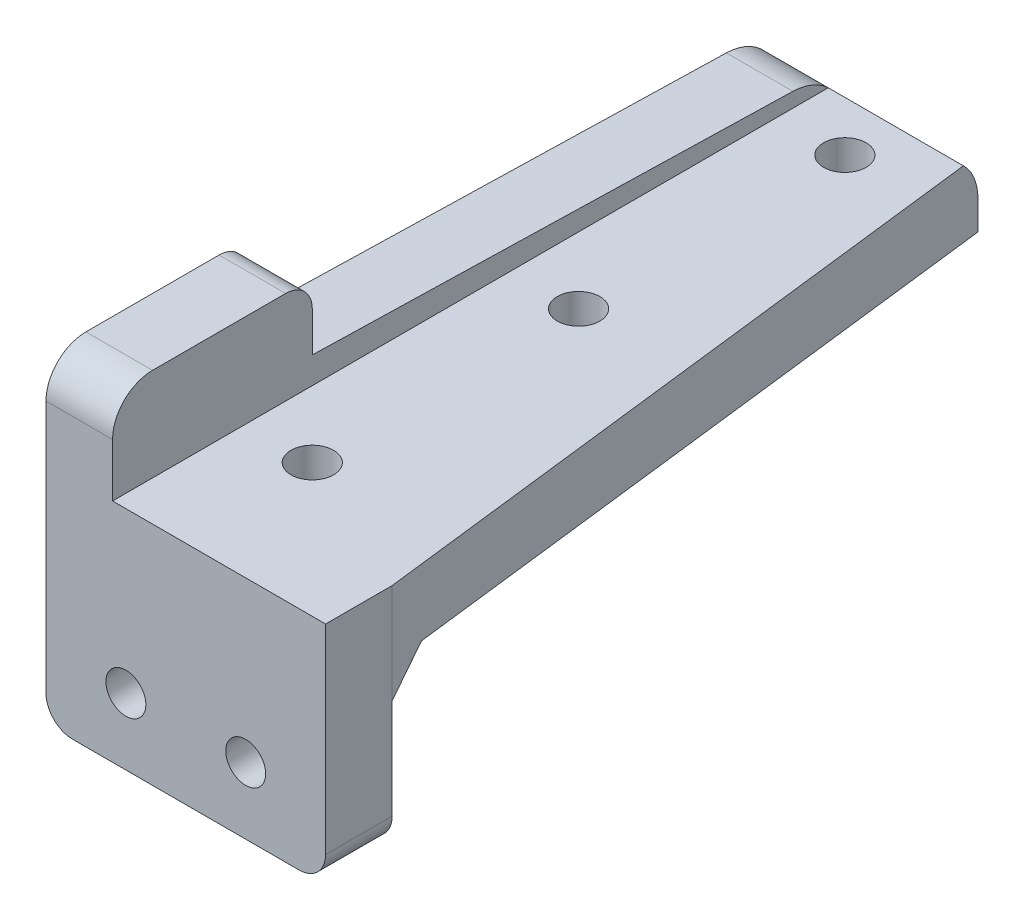
ISO-10303-21;
HEADER;
FILE_DESCRIPTION(('STEP AP214'),'2;1');
FILE_NAME('part.step','',(''),(''),'','','');
FILE_SCHEMA(('AUTOMOTIVE_DESIGN { 1 0 10303 214 1 1 1 1 }'));
ENDSEC;
DATA;
#1=APPLICATION_CONTEXT('core data for automotive mechanical design processes');
#2=APPLICATION_PROTOCOL_DEFINITION('international standard','automotive_design',2000,#1);
#3=PRODUCT_CONTEXT('',#1,'mechanical');
#4=PRODUCT('Part','Part','',(#3));
#5=PRODUCT_RELATED_PRODUCT_CATEGORY('part','',(#4));
#6=PRODUCT_DEFINITION_FORMATION('','',#4);
#7=PRODUCT_DEFINITION_CONTEXT('part definition',#1,'design');
#8=PRODUCT_DEFINITION('design','',#6,#7);
#9=PRODUCT_DEFINITION_SHAPE('','',#8);
#10=(LENGTH_UNIT() NAMED_UNIT(*) SI_UNIT(.MILLI.,.METRE.));
#11=(NAMED_UNIT(*) PLANE_ANGLE_UNIT() SI_UNIT($,.RADIAN.));
#12=(NAMED_UNIT(*) SI_UNIT($,.STERADIAN.) SOLID_ANGLE_UNIT());
#13=UNCERTAINTY_MEASURE_WITH_UNIT(LENGTH_MEASURE(1.E-05),#10,'distance_accuracy_value','');
#14=(GEOMETRIC_REPRESENTATION_CONTEXT(3) GLOBAL_UNCERTAINTY_ASSIGNED_CONTEXT((#13)) GLOBAL_UNIT_ASSIGNED_CONTEXT((#10,
#11,#12)) REPRESENTATION_CONTEXT('',''));
#15=CARTESIAN_POINT('',(0.,0.,0.));
#16=DIRECTION('',(0.,0.,1.));
#17=DIRECTION('',(1.,0.,0.));
#18=AXIS2_PLACEMENT_3D('',#15,#16,#17);
#19=CARTESIAN_POINT('',(0.,0.,25.));
#20=DIRECTION('',(0.,0.,1.));
#21=DIRECTION('',(1.,0.,0.));
#22=AXIS2_PLACEMENT_3D('',#19,#20,#21);
#23=PLANE('',#22);
#24=CARTESIAN_POINT('',(7.5,-7.,25.));
#25=DIRECTION('',(0.,0.,1.));
#26=DIRECTION('',(1.,0.,0.));
#27=AXIS2_PLACEMENT_3D('',#24,#25,#26);
#28=CIRCLE('',#27,1.5);
#29=CARTESIAN_POINT('',(9.00000000000001,-7.,25.));
#30=VERTEX_POINT('',#29);
#31=EDGE_CURVE('E568',#30,#30,#28,.T.);
#32=ORIENTED_EDGE('',*,*,#31,.T.);
#33=EDGE_LOOP('',(#32));
#34=FACE_BOUND('',#33,.T.);
#35=CARTESIAN_POINT('',(-1.5,-7.,25.));
#36=DIRECTION('',(0.,0.,1.));
#37=DIRECTION('',(1.,0.,0.));
#38=AXIS2_PLACEMENT_3D('',#35,#36,#37);
#39=CIRCLE('',#38,1.5);
#40=CARTESIAN_POINT('',(0.,-7.,25.));
#41=VERTEX_POINT('',#40);
#42=EDGE_CURVE('E587',#41,#41,#39,.T.);
#43=ORIENTED_EDGE('',*,*,#42,.T.);
#44=EDGE_LOOP('',(#43));
#45=FACE_BOUND('',#44,.T.);
#46=DIRECTION('',(0.,1.,0.));
#47=VECTOR('',#46,1.);
#48=CARTESIAN_POINT('',(13.5,0.,25.));
#49=LINE('',#48,#47);
#50=CARTESIAN_POINT('',(13.5,-10.,25.));
#51=VERTEX_POINT('',#50);
#52=CARTESIAN_POINT('',(13.5,-2.5,25.));
#53=VERTEX_POINT('',#52);
#54=EDGE_CURVE('E263',#51,#53,#49,.T.);
#55=ORIENTED_EDGE('',*,*,#54,.F.);
#56=CARTESIAN_POINT('',(11.5,-10.,25.));
#57=DIRECTION('',(0.,0.,1.));
#58=DIRECTION('',(1.,0.,0.));
#59=AXIS2_PLACEMENT_3D('',#56,#57,#58);
#60=CIRCLE('',#59,2.);
#61=CARTESIAN_POINT('',(11.5,-12.,25.));
#62=VERTEX_POINT('',#61);
#63=EDGE_CURVE('E12',#51,#62,#60,.F.);
#64=ORIENTED_EDGE('',*,*,#63,.T.);
#65=DIRECTION('',(1.,0.,0.));
#66=VECTOR('',#65,1.);
#67=CARTESIAN_POINT('',(-7.5,-12.,25.));
#68=LINE('',#67,#66);
#69=CARTESIAN_POINT('',(-4.5,-12.,25.));
#70=VERTEX_POINT('',#69);
#71=EDGE_CURVE('E233',#70,#62,#68,.T.);
#72=ORIENTED_EDGE('',*,*,#71,.F.);
#73=DIRECTION('',(0.,1.,0.));
#74=VECTOR('',#73,1.);
#75=CARTESIAN_POINT('',(-4.5,-12.,25.));
#76=LINE('',#75,#74);
#77=CARTESIAN_POINT('',(-4.5,-2.5,25.));
#78=VERTEX_POINT('',#77);
#79=EDGE_CURVE('E244',#70,#78,#76,.T.);
#80=ORIENTED_EDGE('',*,*,#79,.T.);
#81=DIRECTION('',(1.,0.,0.));
#82=VECTOR('',#81,1.);
#83=CARTESIAN_POINT('',(13.5,-2.5,25.));
#84=LINE('',#83,#82);
#85=EDGE_CURVE('E385',#78,#53,#84,.T.);
#86=ORIENTED_EDGE('',*,*,#85,.T.);
#87=EDGE_LOOP('',(#55,#64,#72,#80,#86));
#88=FACE_BOUND('',#87,.T.);
#89=ADVANCED_FACE('F101',(#34,#45,#88),#23,.F.);
#90=CARTESIAN_POINT('',(0.,-2.5,25.));
#91=DIRECTION('',(0.,-0.707106781186544,-0.707106781186551));
#92=DIRECTION('',(-1.,0.,0.));
#93=AXIS2_PLACEMENT_3D('',#90,#91,#92);
#94=PLANE('',#93);
#95=DIRECTION('',(0.,0.707106781186551,-0.707106781186544));
#96=VECTOR('',#95,1.);
#97=CARTESIAN_POINT('',(-4.5,-2.5,25.));
#98=LINE('',#97,#96);
#99=CARTESIAN_POINT('',(-4.5,0.,22.5));
#100=VERTEX_POINT('',#99);
#101=EDGE_CURVE('E249',#78,#100,#98,.T.);
#102=ORIENTED_EDGE('',*,*,#101,.T.);
#103=DIRECTION('',(-1.,0.,0.));
#104=VECTOR('',#103,1.);
#105=CARTESIAN_POINT('',(-7.5,0.,22.5));
#106=LINE('',#105,#104);
#107=CARTESIAN_POINT('',(13.2,0.,22.5));
#108=VERTEX_POINT('',#107);
#109=EDGE_CURVE('E388',#108,#100,#106,.T.);
#110=ORIENTED_EDGE('',*,*,#109,.F.);
#111=DIRECTION('',(0.0845489833163308,-0.704574860969431,0.704574860969423));
#112=VECTOR('',#111,1.);
#113=CARTESIAN_POINT('',(13.4034948371724,-1.69579030976966,24.1957903097697));
#114=LINE('',#113,#112);
#115=EDGE_CURVE('E392',#53,#108,#114,.F.);
#116=ORIENTED_EDGE('',*,*,#115,.F.);
#117=ORIENTED_EDGE('',*,*,#85,.F.);
#118=EDGE_LOOP('',(#102,#110,#116,#117));
#119=FACE_BOUND('',#118,.T.);
#120=ADVANCED_FACE('F436',(#119),#94,.T.);
#121=CARTESIAN_POINT('',(10.3509463722398,5.,-1.24211356466877));
#122=DIRECTION('',(0.992876838486922,0.,-0.119145220618431));
#123=DIRECTION('',(-0.119145220618431,0.,-0.992876838486922));
#124=AXIS2_PLACEMENT_3D('',#121,#122,#123);
#125=PLANE('',#124);
#126=DIRECTION('',(0.,-1.,0.));
#127=VECTOR('',#126,1.);
#128=CARTESIAN_POINT('',(7.5,5.,-25.));
#129=LINE('',#128,#127);
#130=CARTESIAN_POINT('',(7.5,2.09875019525149,-25.));
#131=VERTEX_POINT('',#130);
#132=CARTESIAN_POINT('',(7.5,0.,-25.));
#133=VERTEX_POINT('',#132);
#134=EDGE_CURVE('E346',#131,#133,#129,.T.);
#135=ORIENTED_EDGE('',*,*,#134,.F.);
#136=CARTESIAN_POINT('',(7.98,2.09875019525149,-21.));
#137=DIRECTION('',(0.992876838486922,0.,-0.119145220618431));
#138=DIRECTION('',(0.119145220618431,0.,0.992876838486922));
#139=AXIS2_PLACEMENT_3D('',#136,#137,#138);
#140=ELLIPSE('',#139,4.02869705984453,4.);
#141=CARTESIAN_POINT('',(7.649558486545,5.,-23.7536792787917));
#142=VERTEX_POINT('',#141);
#143=EDGE_CURVE('E363',#131,#142,#140,.T.);
#144=ORIENTED_EDGE('',*,*,#143,.T.);
#145=DIRECTION('',(0.119145220618431,0.,0.992876838486922));
#146=VECTOR('',#145,1.);
#147=CARTESIAN_POINT('',(10.3509463722398,5.,-1.24211356466877));
#148=LINE('',#147,#146);
#149=CARTESIAN_POINT('',(13.5,5.,25.));
#150=VERTEX_POINT('',#149);
#151=EDGE_CURVE('E329',#142,#150,#148,.T.);
#152=ORIENTED_EDGE('',*,*,#151,.T.);
#153=DIRECTION('',(0.,-1.,0.));
#154=VECTOR('',#153,1.);
#155=CARTESIAN_POINT('',(13.5,5.,25.));
#156=LINE('',#155,#154);
#157=EDGE_CURVE('E349',#150,#53,#156,.T.);
#158=ORIENTED_EDGE('',*,*,#157,.T.);
#159=ORIENTED_EDGE('',*,*,#115,.T.);
#160=DIRECTION('',(0.119145220618431,0.,0.992876838486922));
#161=VECTOR('',#160,1.);
#162=CARTESIAN_POINT('',(10.3509463722398,0.,-1.24211356466877));
#163=LINE('',#162,#161);
#164=EDGE_CURVE('E328',#133,#108,#163,.T.);
#165=ORIENTED_EDGE('',*,*,#164,.F.);
#166=EDGE_LOOP('',(#135,#144,#152,#158,#159,#165));
#167=FACE_BOUND('',#166,.T.);
#168=ADVANCED_FACE('F432',(#167),#125,.T.);
#169=CARTESIAN_POINT('',(0.,5.,-25.));
#170=DIRECTION('',(0.,0.,-1.));
#171=DIRECTION('',(-1.,0.,0.));
#172=AXIS2_PLACEMENT_3D('',#169,#170,#171);
#173=PLANE('',#172);
#174=DIRECTION('',(0.,-1.,0.));
#175=VECTOR('',#174,1.);
#176=CARTESIAN_POINT('',(-7.5,5.,-25.));
#177=LINE('',#176,#175);
#178=CARTESIAN_POINT('',(-7.5,2.09875019525149,-25.));
#179=VERTEX_POINT('',#178);
#180=CARTESIAN_POINT('',(-7.5,0.,-25.));
#181=VERTEX_POINT('',#180);
#182=EDGE_CURVE('E332',#179,#181,#177,.T.);
#183=ORIENTED_EDGE('',*,*,#182,.F.);
#184=DIRECTION('',(-1.,0.,0.));
#185=VECTOR('',#184,1.);
#186=CARTESIAN_POINT('',(-2.5,2.09875019525149,-25.));
#187=LINE('',#186,#185);
#188=EDGE_CURVE('E360',#179,#131,#187,.F.);
#189=ORIENTED_EDGE('',*,*,#188,.T.);
#190=ORIENTED_EDGE('',*,*,#134,.T.);
#191=DIRECTION('',(1.,0.,0.));
#192=VECTOR('',#191,1.);
#193=CARTESIAN_POINT('',(0.,0.,-25.));
#194=LINE('',#193,#192);
#195=EDGE_CURVE('E337',#181,#133,#194,.T.);
#196=ORIENTED_EDGE('',*,*,#195,.F.);
#197=EDGE_LOOP('',(#183,#189,#190,#196));
#198=FACE_BOUND('',#197,.T.);
#199=ADVANCED_FACE('F534',(#198),#173,.T.);
#200=CARTESIAN_POINT('',(-7.5,5.,0.));
#201=DIRECTION('',(-1.,0.,0.));
#202=DIRECTION('',(0.,0.,1.));
#203=AXIS2_PLACEMENT_3D('',#200,#201,#202);
#204=PLANE('',#203);
#205=DIRECTION('',(0.,-0.346374082759159,0.938096474139388));
#206=VECTOR('',#205,1.);
#207=CARTESIAN_POINT('',(-7.5,0.,-7.49999999999997));
#208=LINE('',#207,#206);
#209=CARTESIAN_POINT('',(-7.5,0.,-7.49999999999997));
#210=VERTEX_POINT('',#209);
#211=CARTESIAN_POINT('',(-7.5,-10.,19.5833333333333));
#212=VERTEX_POINT('',#211);
#213=EDGE_CURVE('E259',#210,#212,#208,.T.);
#214=ORIENTED_EDGE('',*,*,#213,.T.);
#215=DIRECTION('',(0.,0.,-1.));
#216=VECTOR('',#215,1.);
#217=CARTESIAN_POINT('',(-7.5,-10.,30.));
#218=LINE('',#217,#216);
#219=CARTESIAN_POINT('',(-7.5,-10.,30.));
#220=VERTEX_POINT('',#219);
#221=EDGE_CURVE('E416',#212,#220,#218,.F.);
#222=ORIENTED_EDGE('',*,*,#221,.T.);
#223=DIRECTION('',(0.,-1.,0.));
#224=VECTOR('',#223,1.);
#225=CARTESIAN_POINT('',(-7.5,12.,30.));
#226=LINE('',#225,#224);
#227=CARTESIAN_POINT('',(-7.5,9.00000000000001,30.));
#228=VERTEX_POINT('',#227);
#229=EDGE_CURVE('E462',#228,#220,#226,.T.);
#230=ORIENTED_EDGE('',*,*,#229,.F.);
#231=CARTESIAN_POINT('',(-7.5,9.00000000000001,27.));
#232=DIRECTION('',(-1.,0.,0.));
#233=DIRECTION('',(0.,0.,1.));
#234=AXIS2_PLACEMENT_3D('',#231,#232,#233);
#235=CIRCLE('',#234,3.);
#236=CARTESIAN_POINT('',(-7.5,12.,27.));
#237=VERTEX_POINT('',#236);
#238=EDGE_CURVE('E399',#228,#237,#235,.T.);
#239=ORIENTED_EDGE('',*,*,#238,.T.);
#240=DIRECTION('',(0.,0.,1.));
#241=VECTOR('',#240,1.);
#242=CARTESIAN_POINT('',(-7.5,12.,0.));
#243=LINE('',#242,#241);
#244=CARTESIAN_POINT('',(-7.5,12.,17.));
#245=VERTEX_POINT('',#244);
#246=EDGE_CURVE('E279',#245,#237,#243,.T.);
#247=ORIENTED_EDGE('',*,*,#246,.F.);
#248=CARTESIAN_POINT('',(-7.5,10.,17.));
#249=DIRECTION('',(-1.,0.,0.));
#250=DIRECTION('',(0.,0.,1.));
#251=AXIS2_PLACEMENT_3D('',#248,#249,#250);
#252=CIRCLE('',#251,2.);
#253=CARTESIAN_POINT('',(-7.5,10.,15.));
#254=VERTEX_POINT('',#253);
#255=EDGE_CURVE('E376',#245,#254,#252,.T.);
#256=ORIENTED_EDGE('',*,*,#255,.T.);
#257=DIRECTION('',(0.,1.,0.));
#258=VECTOR('',#257,1.);
#259=CARTESIAN_POINT('',(-7.5,0.,15.));
#260=LINE('',#259,#258);
#261=CARTESIAN_POINT('',(-7.5,7.00000000000001,15.));
#262=VERTEX_POINT('',#261);
#263=EDGE_CURVE('E319',#262,#254,#260,.T.);
#264=ORIENTED_EDGE('',*,*,#263,.F.);
#265=DIRECTION('',(0.,0.0249921911602033,0.999687646408123));
#266=VECTOR('',#265,1.);
#267=CARTESIAN_POINT('',(-7.5,6.62086196127421,-0.165521549031856));
#268=LINE('',#267,#266);
#269=CARTESIAN_POINT('',(-7.5,6.09750078088398,-21.0999687646408));
#270=VERTEX_POINT('',#269);
#271=EDGE_CURVE('E304',#270,#262,#268,.T.);
#272=ORIENTED_EDGE('',*,*,#271,.F.);
#273=CARTESIAN_POINT('',(-7.5,2.09875019525149,-21.));
#274=DIRECTION('',(-1.,0.,0.));
#275=DIRECTION('',(0.,0.,1.));
#276=AXIS2_PLACEMENT_3D('',#273,#274,#275);
#277=CIRCLE('',#276,4.);
#278=EDGE_CURVE('E357',#270,#179,#277,.T.);
#279=ORIENTED_EDGE('',*,*,#278,.T.);
#280=ORIENTED_EDGE('',*,*,#182,.T.);
#281=DIRECTION('',(0.,0.,-1.));
#282=VECTOR('',#281,1.);
#283=CARTESIAN_POINT('',(-7.5,0.,0.));
#284=LINE('',#283,#282);
#285=EDGE_CURVE('E333',#210,#181,#284,.T.);
#286=ORIENTED_EDGE('',*,*,#285,.F.);
#287=EDGE_LOOP('',(#214,#222,#230,#239,#247,#256,#264,#272,#279,#280,#286));
#288=FACE_BOUND('',#287,.T.);
#289=ADVANCED_FACE('F527',(#288),#204,.T.);
#290=CARTESIAN_POINT('',(0.,5.,0.));
#291=DIRECTION('',(0.,1.,0.));
#292=DIRECTION('',(0.,0.,1.));
#293=AXIS2_PLACEMENT_3D('',#290,#291,#292);
#294=PLANE('',#293);
#295=CARTESIAN_POINT('',(2.5,5.,-20.));
#296=DIRECTION('',(0.,1.,0.));
#297=DIRECTION('',(0.,0.,1.));
#298=AXIS2_PLACEMENT_3D('',#295,#296,#297);
#299=CIRCLE('',#298,1.6);
#300=CARTESIAN_POINT('',(2.5,5.,-18.4));
#301=VERTEX_POINT('',#300);
#302=EDGE_CURVE('E280',#301,#301,#299,.T.);
#303=ORIENTED_EDGE('',*,*,#302,.F.);
#304=EDGE_LOOP('',(#303));
#305=FACE_BOUND('',#304,.T.);
#306=CARTESIAN_POINT('',(2.5,5.,0.));
#307=DIRECTION('',(0.,1.,0.));
#308=DIRECTION('',(0.,0.,1.));
#309=AXIS2_PLACEMENT_3D('',#306,#307,#308);
#310=CIRCLE('',#309,1.6);
#311=CARTESIAN_POINT('',(2.5,5.,1.6));
#312=VERTEX_POINT('',#311);
#313=EDGE_CURVE('E284',#312,#312,#310,.T.);
#314=ORIENTED_EDGE('',*,*,#313,.F.);
#315=EDGE_LOOP('',(#314));
#316=FACE_BOUND('',#315,.T.);
#317=CARTESIAN_POINT('',(2.5,5.,20.));
#318=DIRECTION('',(0.,1.,0.));
#319=DIRECTION('',(0.,0.,1.));
#320=AXIS2_PLACEMENT_3D('',#317,#318,#319);
#321=CIRCLE('',#320,1.6);
#322=CARTESIAN_POINT('',(2.5,5.,21.6));
#323=VERTEX_POINT('',#322);
#324=EDGE_CURVE('E292',#323,#323,#321,.T.);
#325=ORIENTED_EDGE('',*,*,#324,.F.);
#326=EDGE_LOOP('',(#325));
#327=FACE_BOUND('',#326,.T.);
#328=ORIENTED_EDGE('',*,*,#151,.F.);
#329=DIRECTION('',(1.,0.,0.));
#330=VECTOR('',#329,1.);
#331=CARTESIAN_POINT('',(7.649558486545,5.,-23.7536792787917));
#332=LINE('',#331,#330);
#333=CARTESIAN_POINT('',(-2.5,5.,-23.7536792787917));
#334=VERTEX_POINT('',#333);
#335=EDGE_CURVE('E366',#142,#334,#332,.F.);
#336=ORIENTED_EDGE('',*,*,#335,.T.);
#337=DIRECTION('',(0.,0.,-1.));
#338=VECTOR('',#337,1.);
#339=CARTESIAN_POINT('',(-2.5,5.,0.));
#340=LINE('',#339,#338);
#341=CARTESIAN_POINT('',(-2.5,5.,30.));
#342=VERTEX_POINT('',#341);
#343=EDGE_CURVE('E311',#342,#334,#340,.T.);
#344=ORIENTED_EDGE('',*,*,#343,.F.);
#345=DIRECTION('',(-1.,0.,0.));
#346=VECTOR('',#345,1.);
#347=CARTESIAN_POINT('',(13.5,5.,30.));
#348=LINE('',#347,#346);
#349=CARTESIAN_POINT('',(13.5,5.,30.));
#350=VERTEX_POINT('',#349);
#351=EDGE_CURVE('E463',#350,#342,#348,.T.);
#352=ORIENTED_EDGE('',*,*,#351,.F.);
#353=DIRECTION('',(0.,0.,-1.));
#354=VECTOR('',#353,1.);
#355=CARTESIAN_POINT('',(13.5,5.,30.));
#356=LINE('',#355,#354);
#357=EDGE_CURVE('E269',#350,#150,#356,.T.);
#358=ORIENTED_EDGE('',*,*,#357,.T.);
#359=EDGE_LOOP('',(#328,#336,#344,#352,#358));
#360=FACE_BOUND('',#359,.T.);
#361=ADVANCED_FACE('F450',(#305,#316,#327,#360),#294,.T.);
#362=CARTESIAN_POINT('',(0.,0.,0.));
#363=DIRECTION('',(0.,1.,0.));
#364=DIRECTION('',(0.,0.,1.));
#365=AXIS2_PLACEMENT_3D('',#362,#363,#364);
#366=PLANE('',#365);
#367=CARTESIAN_POINT('',(2.5,0.,-20.));
#368=DIRECTION('',(0.,1.,0.));
#369=DIRECTION('',(0.,0.,1.));
#370=AXIS2_PLACEMENT_3D('',#367,#368,#369);
#371=CIRCLE('',#370,1.6);
#372=CARTESIAN_POINT('',(2.5,0.,-18.4));
#373=VERTEX_POINT('',#372);
#374=EDGE_CURVE('E275',#373,#373,#371,.T.);
#375=ORIENTED_EDGE('',*,*,#374,.T.);
#376=EDGE_LOOP('',(#375));
#377=FACE_BOUND('',#376,.T.);
#378=CARTESIAN_POINT('',(2.5,0.,0.));
#379=DIRECTION('',(0.,1.,0.));
#380=DIRECTION('',(0.,0.,1.));
#381=AXIS2_PLACEMENT_3D('',#378,#379,#380);
#382=CIRCLE('',#381,1.6);
#383=CARTESIAN_POINT('',(2.5,0.,1.6));
#384=VERTEX_POINT('',#383);
#385=EDGE_CURVE('E288',#384,#384,#382,.T.);
#386=ORIENTED_EDGE('',*,*,#385,.T.);
#387=EDGE_LOOP('',(#386));
#388=FACE_BOUND('',#387,.T.);
#389=CARTESIAN_POINT('',(2.5,0.,20.));
#390=DIRECTION('',(0.,1.,0.));
#391=DIRECTION('',(0.,0.,1.));
#392=AXIS2_PLACEMENT_3D('',#389,#390,#391);
#393=CIRCLE('',#392,1.6);
#394=CARTESIAN_POINT('',(2.5,0.,21.6));
#395=VERTEX_POINT('',#394);
#396=EDGE_CURVE('E273',#395,#395,#393,.T.);
#397=ORIENTED_EDGE('',*,*,#396,.T.);
#398=EDGE_LOOP('',(#397));
#399=FACE_BOUND('',#398,.T.);
#400=DIRECTION('',(0.,0.,-1.));
#401=VECTOR('',#400,1.);
#402=CARTESIAN_POINT('',(-4.5,0.,22.5));
#403=LINE('',#402,#401);
#404=CARTESIAN_POINT('',(-4.5,0.,-7.49999999999997));
#405=VERTEX_POINT('',#404);
#406=EDGE_CURVE('E439',#100,#405,#403,.T.);
#407=ORIENTED_EDGE('',*,*,#406,.T.);
#408=DIRECTION('',(-1.,0.,0.));
#409=VECTOR('',#408,1.);
#410=CARTESIAN_POINT('',(-4.5,0.,-7.49999999999997));
#411=LINE('',#410,#409);
#412=EDGE_CURVE('E257',#405,#210,#411,.T.);
#413=ORIENTED_EDGE('',*,*,#412,.T.);
#414=ORIENTED_EDGE('',*,*,#285,.T.);
#415=ORIENTED_EDGE('',*,*,#195,.T.);
#416=ORIENTED_EDGE('',*,*,#164,.T.);
#417=ORIENTED_EDGE('',*,*,#109,.T.);
#418=EDGE_LOOP('',(#407,#413,#414,#415,#416,#417));
#419=FACE_BOUND('',#418,.T.);
#420=ADVANCED_FACE('F438',(#377,#388,#399,#419),#366,.F.);
#421=CARTESIAN_POINT('',(-2.5,6.62086196127421,-0.165521549031856));
#422=DIRECTION('',(0.,-0.999687646408123,0.0249921911602032));
#423=DIRECTION('',(0.,-0.0249921911602033,-0.999687646408123));
#424=AXIS2_PLACEMENT_3D('',#421,#422,#423);
#425=PLANE('',#424);
#426=DIRECTION('',(0.,0.0249921911602033,0.999687646408123));
#427=VECTOR('',#426,1.);
#428=CARTESIAN_POINT('',(-2.5,6.62086196127421,-0.165521549031856));
#429=LINE('',#428,#427);
#430=CARTESIAN_POINT('',(-2.5,6.09750078088398,-21.0999687646408));
#431=VERTEX_POINT('',#430);
#432=CARTESIAN_POINT('',(-2.5,7.00000000000001,15.));
#433=VERTEX_POINT('',#432);
#434=EDGE_CURVE('E308',#431,#433,#429,.T.);
#435=ORIENTED_EDGE('',*,*,#434,.F.);
#436=DIRECTION('',(-1.,0.,0.));
#437=VECTOR('',#436,1.);
#438=CARTESIAN_POINT('',(-7.5,6.09750078088398,-21.0999687646408));
#439=LINE('',#438,#437);
#440=EDGE_CURVE('E353',#431,#270,#439,.T.);
#441=ORIENTED_EDGE('',*,*,#440,.T.);
#442=ORIENTED_EDGE('',*,*,#271,.T.);
#443=DIRECTION('',(-1.,0.,0.));
#444=VECTOR('',#443,1.);
#445=CARTESIAN_POINT('',(-2.5,7.00000000000001,15.));
#446=LINE('',#445,#444);
#447=EDGE_CURVE('E315',#433,#262,#446,.T.);
#448=ORIENTED_EDGE('',*,*,#447,.F.);
#449=EDGE_LOOP('',(#435,#441,#442,#448));
#450=FACE_BOUND('',#449,.T.);
#451=ADVANCED_FACE('F514',(#450),#425,.F.);
#452=CARTESIAN_POINT('',(-2.5,0.,15.));
#453=DIRECTION('',(0.,0.,1.));
#454=DIRECTION('',(1.,0.,0.));
#455=AXIS2_PLACEMENT_3D('',#452,#453,#454);
#456=PLANE('',#455);
#457=ORIENTED_EDGE('',*,*,#263,.T.);
#458=DIRECTION('',(-1.,0.,0.));
#459=VECTOR('',#458,1.);
#460=CARTESIAN_POINT('',(-2.5,10.,15.));
#461=LINE('',#460,#459);
#462=CARTESIAN_POINT('',(-2.5,10.,15.));
#463=VERTEX_POINT('',#462);
#464=EDGE_CURVE('E379',#254,#463,#461,.F.);
#465=ORIENTED_EDGE('',*,*,#464,.T.);
#466=DIRECTION('',(0.,1.,0.));
#467=VECTOR('',#466,1.);
#468=CARTESIAN_POINT('',(-2.5,0.,15.));
#469=LINE('',#468,#467);
#470=EDGE_CURVE('E303',#433,#463,#469,.T.);
#471=ORIENTED_EDGE('',*,*,#470,.F.);
#472=ORIENTED_EDGE('',*,*,#447,.T.);
#473=EDGE_LOOP('',(#457,#465,#471,#472));
#474=FACE_BOUND('',#473,.T.);
#475=ADVANCED_FACE('F517',(#474),#456,.F.);
#476=CARTESIAN_POINT('',(-2.5,12.,0.));
#477=DIRECTION('',(0.,-1.,0.));
#478=DIRECTION('',(0.,0.,-1.));
#479=AXIS2_PLACEMENT_3D('',#476,#477,#478);
#480=PLANE('',#479);
#481=ORIENTED_EDGE('',*,*,#246,.T.);
#482=DIRECTION('',(-1.,0.,0.));
#483=VECTOR('',#482,1.);
#484=CARTESIAN_POINT('',(-2.5,12.,27.));
#485=LINE('',#484,#483);
#486=CARTESIAN_POINT('',(-2.5,12.,27.));
#487=VERTEX_POINT('',#486);
#488=EDGE_CURVE('E402',#237,#487,#485,.F.);
#489=ORIENTED_EDGE('',*,*,#488,.T.);
#490=DIRECTION('',(0.,0.,1.));
#491=VECTOR('',#490,1.);
#492=CARTESIAN_POINT('',(-2.5,12.,0.));
#493=LINE('',#492,#491);
#494=CARTESIAN_POINT('',(-2.5,12.,17.));
#495=VERTEX_POINT('',#494);
#496=EDGE_CURVE('E299',#495,#487,#493,.T.);
#497=ORIENTED_EDGE('',*,*,#496,.F.);
#498=DIRECTION('',(-1.,0.,0.));
#499=VECTOR('',#498,1.);
#500=CARTESIAN_POINT('',(-2.5,12.,17.));
#501=LINE('',#500,#499);
#502=EDGE_CURVE('E372',#495,#245,#501,.T.);
#503=ORIENTED_EDGE('',*,*,#502,.T.);
#504=EDGE_LOOP('',(#481,#489,#497,#503));
#505=FACE_BOUND('',#504,.T.);
#506=ADVANCED_FACE('F513',(#505),#480,.F.);
#507=CARTESIAN_POINT('',(-2.5,0.,0.));
#508=DIRECTION('',(-1.,0.,0.));
#509=DIRECTION('',(0.,0.,1.));
#510=AXIS2_PLACEMENT_3D('',#507,#508,#509);
#511=PLANE('',#510);
#512=ORIENTED_EDGE('',*,*,#496,.T.);
#513=CARTESIAN_POINT('',(-2.5,9.00000000000001,27.));
#514=DIRECTION('',(-1.,0.,0.));
#515=DIRECTION('',(0.,0.,1.));
#516=AXIS2_PLACEMENT_3D('',#513,#514,#515);
#517=CIRCLE('',#516,3.);
#518=CARTESIAN_POINT('',(-2.5,9.00000000000001,30.));
#519=VERTEX_POINT('',#518);
#520=EDGE_CURVE('E405',#487,#519,#517,.F.);
#521=ORIENTED_EDGE('',*,*,#520,.T.);
#522=DIRECTION('',(0.,1.,0.));
#523=VECTOR('',#522,1.);
#524=CARTESIAN_POINT('',(-2.5,5.,30.));
#525=LINE('',#524,#523);
#526=EDGE_CURVE('E458',#342,#519,#525,.T.);
#527=ORIENTED_EDGE('',*,*,#526,.F.);
#528=ORIENTED_EDGE('',*,*,#343,.T.);
#529=CARTESIAN_POINT('',(-2.5,2.09875019525149,-21.));
#530=DIRECTION('',(-1.,0.,0.));
#531=DIRECTION('',(0.,0.,1.));
#532=AXIS2_PLACEMENT_3D('',#529,#530,#531);
#533=CIRCLE('',#532,4.);
#534=EDGE_CURVE('E369',#334,#431,#533,.F.);
#535=ORIENTED_EDGE('',*,*,#534,.T.);
#536=ORIENTED_EDGE('',*,*,#434,.T.);
#537=ORIENTED_EDGE('',*,*,#470,.T.);
#538=CARTESIAN_POINT('',(-2.5,10.,17.));
#539=DIRECTION('',(-1.,0.,0.));
#540=DIRECTION('',(0.,0.,1.));
#541=AXIS2_PLACEMENT_3D('',#538,#539,#540);
#542=CIRCLE('',#541,2.);
#543=EDGE_CURVE('E382',#463,#495,#542,.F.);
#544=ORIENTED_EDGE('',*,*,#543,.T.);
#545=EDGE_LOOP('',(#512,#521,#527,#528,#535,#536,#537,#544));
#546=FACE_BOUND('',#545,.T.);
#547=ADVANCED_FACE('F455',(#546),#511,.F.);
#548=CARTESIAN_POINT('',(-2.5,2.09875019525149,-21.));
#549=DIRECTION('',(1.,0.,0.));
#550=DIRECTION('',(0.,0.,-1.));
#551=AXIS2_PLACEMENT_3D('',#548,#549,#550);
#552=CYLINDRICAL_SURFACE('',#551,4.);
#553=ORIENTED_EDGE('',*,*,#143,.F.);
#554=ORIENTED_EDGE('',*,*,#188,.F.);
#555=ORIENTED_EDGE('',*,*,#278,.F.);
#556=ORIENTED_EDGE('',*,*,#440,.F.);
#557=ORIENTED_EDGE('',*,*,#534,.F.);
#558=ORIENTED_EDGE('',*,*,#335,.F.);
#559=EDGE_LOOP('',(#553,#554,#555,#556,#557,#558));
#560=FACE_BOUND('',#559,.T.);
#561=ADVANCED_FACE('F446',(#560),#552,.T.);
#562=CARTESIAN_POINT('',(-2.5,10.,17.));
#563=DIRECTION('',(-1.,0.,0.));
#564=DIRECTION('',(0.,0.,1.));
#565=AXIS2_PLACEMENT_3D('',#562,#563,#564);
#566=CYLINDRICAL_SURFACE('',#565,2.);
#567=ORIENTED_EDGE('',*,*,#543,.F.);
#568=ORIENTED_EDGE('',*,*,#464,.F.);
#569=ORIENTED_EDGE('',*,*,#255,.F.);
#570=ORIENTED_EDGE('',*,*,#502,.F.);
#571=EDGE_LOOP('',(#567,#568,#569,#570));
#572=FACE_BOUND('',#571,.T.);
#573=ADVANCED_FACE('F509',(#572),#566,.T.);
#574=CARTESIAN_POINT('',(2.5,0.,20.));
#575=DIRECTION('',(0.,1.,0.));
#576=DIRECTION('',(0.,0.,1.));
#577=AXIS2_PLACEMENT_3D('',#574,#575,#576);
#578=CYLINDRICAL_SURFACE('',#577,1.6);
#579=ORIENTED_EDGE('',*,*,#396,.F.);
#580=EDGE_LOOP('',(#579));
#581=FACE_BOUND('',#580,.T.);
#582=ORIENTED_EDGE('',*,*,#324,.T.);
#583=EDGE_LOOP('',(#582));
#584=FACE_BOUND('',#583,.T.);
#585=ADVANCED_FACE('F505',(#581,#584),#578,.F.);
#586=CARTESIAN_POINT('',(2.5,0.,0.));
#587=DIRECTION('',(0.,1.,0.));
#588=DIRECTION('',(0.,0.,1.));
#589=AXIS2_PLACEMENT_3D('',#586,#587,#588);
#590=CYLINDRICAL_SURFACE('',#589,1.6);
#591=ORIENTED_EDGE('',*,*,#385,.F.);
#592=EDGE_LOOP('',(#591));
#593=FACE_BOUND('',#592,.T.);
#594=ORIENTED_EDGE('',*,*,#313,.T.);
#595=EDGE_LOOP('',(#594));
#596=FACE_BOUND('',#595,.T.);
#597=ADVANCED_FACE('F501',(#593,#596),#590,.F.);
#598=CARTESIAN_POINT('',(2.5,0.,-20.));
#599=DIRECTION('',(0.,1.,0.));
#600=DIRECTION('',(0.,0.,1.));
#601=AXIS2_PLACEMENT_3D('',#598,#599,#600);
#602=CYLINDRICAL_SURFACE('',#601,1.6);
#603=ORIENTED_EDGE('',*,*,#374,.F.);
#604=EDGE_LOOP('',(#603));
#605=FACE_BOUND('',#604,.T.);
#606=ORIENTED_EDGE('',*,*,#302,.T.);
#607=EDGE_LOOP('',(#606));
#608=FACE_BOUND('',#607,.T.);
#609=ADVANCED_FACE('F498',(#605,#608),#602,.F.);
#610=CARTESIAN_POINT('',(0.,0.,30.));
#611=DIRECTION('',(0.,0.,1.));
#612=DIRECTION('',(1.,0.,0.));
#613=AXIS2_PLACEMENT_3D('',#610,#611,#612);
#614=PLANE('',#613);
#615=CARTESIAN_POINT('',(-1.5,-7.,30.));
#616=DIRECTION('',(0.,0.,1.));
#617=DIRECTION('',(1.,0.,0.));
#618=AXIS2_PLACEMENT_3D('',#615,#616,#617);
#619=CIRCLE('',#618,1.5);
#620=CARTESIAN_POINT('',(0.,-7.,30.));
#621=VERTEX_POINT('',#620);
#622=EDGE_CURVE('E265',#621,#621,#619,.T.);
#623=ORIENTED_EDGE('',*,*,#622,.F.);
#624=EDGE_LOOP('',(#623));
#625=FACE_BOUND('',#624,.T.);
#626=ORIENTED_EDGE('',*,*,#229,.T.);
#627=CARTESIAN_POINT('',(-5.5,-10.,30.));
#628=DIRECTION('',(0.,0.,1.));
#629=DIRECTION('',(1.,0.,0.));
#630=AXIS2_PLACEMENT_3D('',#627,#628,#629);
#631=CIRCLE('',#630,2.);
#632=CARTESIAN_POINT('',(-5.5,-12.,30.));
#633=VERTEX_POINT('',#632);
#634=EDGE_CURVE('E421',#220,#633,#631,.T.);
#635=ORIENTED_EDGE('',*,*,#634,.T.);
#636=DIRECTION('',(1.,0.,0.));
#637=VECTOR('',#636,1.);
#638=CARTESIAN_POINT('',(-7.5,-12.,30.));
#639=LINE('',#638,#637);
#640=CARTESIAN_POINT('',(11.5,-12.,30.));
#641=VERTEX_POINT('',#640);
#642=EDGE_CURVE('E274',#633,#641,#639,.T.);
#643=ORIENTED_EDGE('',*,*,#642,.T.);
#644=CARTESIAN_POINT('',(11.5,-10.,30.));
#645=DIRECTION('',(0.,0.,1.));
#646=DIRECTION('',(1.,0.,0.));
#647=AXIS2_PLACEMENT_3D('',#644,#645,#646);
#648=CIRCLE('',#647,2.);
#649=CARTESIAN_POINT('',(13.5,-10.,30.));
#650=VERTEX_POINT('',#649);
#651=EDGE_CURVE('E123',#641,#650,#648,.T.);
#652=ORIENTED_EDGE('',*,*,#651,.T.);
#653=DIRECTION('',(0.,1.,0.));
#654=VECTOR('',#653,1.);
#655=CARTESIAN_POINT('',(13.5,-12.,30.));
#656=LINE('',#655,#654);
#657=EDGE_CURVE('E239',#650,#350,#656,.T.);
#658=ORIENTED_EDGE('',*,*,#657,.T.);
#659=ORIENTED_EDGE('',*,*,#351,.T.);
#660=ORIENTED_EDGE('',*,*,#526,.T.);
#661=DIRECTION('',(-1.,0.,0.));
#662=VECTOR('',#661,1.);
#663=CARTESIAN_POINT('',(-7.5,9.00000000000001,30.));
#664=LINE('',#663,#662);
#665=EDGE_CURVE('E395',#519,#228,#664,.T.);
#666=ORIENTED_EDGE('',*,*,#665,.T.);
#667=EDGE_LOOP('',(#626,#635,#643,#652,#658,#659,#660,#666));
#668=FACE_BOUND('',#667,.T.);
#669=CARTESIAN_POINT('',(7.5,-7.,30.));
#670=DIRECTION('',(0.,0.,1.));
#671=DIRECTION('',(1.,0.,0.));
#672=AXIS2_PLACEMENT_3D('',#669,#670,#671);
#673=CIRCLE('',#672,1.5);
#674=CARTESIAN_POINT('',(9.00000000000001,-7.,30.));
#675=VERTEX_POINT('',#674);
#676=EDGE_CURVE('E581',#675,#675,#673,.T.);
#677=ORIENTED_EDGE('',*,*,#676,.F.);
#678=EDGE_LOOP('',(#677));
#679=FACE_BOUND('',#678,.T.);
#680=ADVANCED_FACE('F472',(#625,#668,#679),#614,.T.);
#681=CARTESIAN_POINT('',(13.5,0.,30.));
#682=DIRECTION('',(-1.,0.,0.));
#683=DIRECTION('',(0.,0.,1.));
#684=AXIS2_PLACEMENT_3D('',#681,#682,#683);
#685=PLANE('',#684);
#686=ORIENTED_EDGE('',*,*,#657,.F.);
#687=DIRECTION('',(0.,0.,-1.));
#688=VECTOR('',#687,1.);
#689=CARTESIAN_POINT('',(13.5,-10.,30.));
#690=LINE('',#689,#688);
#691=EDGE_CURVE('E110',#650,#51,#690,.T.);
#692=ORIENTED_EDGE('',*,*,#691,.T.);
#693=ORIENTED_EDGE('',*,*,#54,.T.);
#694=ORIENTED_EDGE('',*,*,#157,.F.);
#695=ORIENTED_EDGE('',*,*,#357,.F.);
#696=EDGE_LOOP('',(#686,#692,#693,#694,#695));
#697=FACE_BOUND('',#696,.T.);
#698=ADVANCED_FACE('F425',(#697),#685,.F.);
#699=CARTESIAN_POINT('',(-7.5,-12.,30.));
#700=DIRECTION('',(0.,1.,0.));
#701=DIRECTION('',(0.,0.,1.));
#702=AXIS2_PLACEMENT_3D('',#699,#700,#701);
#703=PLANE('',#702);
#704=ORIENTED_EDGE('',*,*,#642,.F.);
#705=DIRECTION('',(0.,0.,-1.));
#706=VECTOR('',#705,1.);
#707=CARTESIAN_POINT('',(-5.5,-12.,25.));
#708=LINE('',#707,#706);
#709=CARTESIAN_POINT('',(-5.5,-12.,25.));
#710=VERTEX_POINT('',#709);
#711=EDGE_CURVE('E235',#633,#710,#708,.T.);
#712=ORIENTED_EDGE('',*,*,#711,.T.);
#713=EDGE_CURVE('E228',#710,#70,#68,.T.);
#714=ORIENTED_EDGE('',*,*,#713,.T.);
#715=ORIENTED_EDGE('',*,*,#71,.T.);
#716=DIRECTION('',(0.,0.,-1.));
#717=VECTOR('',#716,1.);
#718=CARTESIAN_POINT('',(11.5,-12.,30.));
#719=LINE('',#718,#717);
#720=EDGE_CURVE('E408',#62,#641,#719,.F.);
#721=ORIENTED_EDGE('',*,*,#720,.T.);
#722=EDGE_LOOP('',(#704,#712,#714,#715,#721));
#723=FACE_BOUND('',#722,.T.);
#724=ADVANCED_FACE('F231',(#723),#703,.F.);
#725=CARTESIAN_POINT('',(-1.5,-7.,30.));
#726=DIRECTION('',(0.,0.,-1.));
#727=DIRECTION('',(-1.,0.,0.));
#728=AXIS2_PLACEMENT_3D('',#725,#726,#727);
#729=CYLINDRICAL_SURFACE('',#728,1.5);
#730=ORIENTED_EDGE('',*,*,#622,.T.);
#731=EDGE_LOOP('',(#730));
#732=FACE_BOUND('',#731,.T.);
#733=ORIENTED_EDGE('',*,*,#42,.F.);
#734=EDGE_LOOP('',(#733));
#735=FACE_BOUND('',#734,.T.);
#736=ADVANCED_FACE('F495',(#732,#735),#729,.F.);
#737=CARTESIAN_POINT('',(7.5,-7.,30.));
#738=DIRECTION('',(0.,0.,-1.));
#739=DIRECTION('',(-1.,0.,0.));
#740=AXIS2_PLACEMENT_3D('',#737,#738,#739);
#741=CYLINDRICAL_SURFACE('',#740,1.5);
#742=ORIENTED_EDGE('',*,*,#676,.T.);
#743=EDGE_LOOP('',(#742));
#744=FACE_BOUND('',#743,.T.);
#745=ORIENTED_EDGE('',*,*,#31,.F.);
#746=EDGE_LOOP('',(#745));
#747=FACE_BOUND('',#746,.T.);
#748=ADVANCED_FACE('F550',(#744,#747),#741,.F.);
#749=CARTESIAN_POINT('',(0.,9.00000000000001,27.));
#750=DIRECTION('',(1.,0.,0.));
#751=DIRECTION('',(0.,0.,-1.));
#752=AXIS2_PLACEMENT_3D('',#749,#750,#751);
#753=CYLINDRICAL_SURFACE('',#752,3.);
#754=ORIENTED_EDGE('',*,*,#520,.F.);
#755=ORIENTED_EDGE('',*,*,#488,.F.);
#756=ORIENTED_EDGE('',*,*,#238,.F.);
#757=ORIENTED_EDGE('',*,*,#665,.F.);
#758=EDGE_LOOP('',(#754,#755,#756,#757));
#759=FACE_BOUND('',#758,.T.);
#760=ADVANCED_FACE('F548',(#759),#753,.T.);
#761=CARTESIAN_POINT('',(-4.5,0.,-7.49999999999997));
#762=DIRECTION('',(0.,-0.938096474139388,-0.346374082759159));
#763=DIRECTION('',(0.,0.346374082759159,-0.938096474139388));
#764=AXIS2_PLACEMENT_3D('',#761,#762,#763);
#765=PLANE('',#764);
#766=ORIENTED_EDGE('',*,*,#713,.F.);
#767=CARTESIAN_POINT('',(-5.5,-10.,19.5833333333333));
#768=DIRECTION('',(0.,-0.938096474139388,-0.346374082759159));
#769=DIRECTION('',(0.,-0.346374082759159,0.938096474139388));
#770=AXIS2_PLACEMENT_3D('',#767,#768,#769);
#771=ELLIPSE('',#770,5.77410406710667,2.);
#772=EDGE_CURVE('E413',#710,#212,#771,.T.);
#773=ORIENTED_EDGE('',*,*,#772,.T.);
#774=ORIENTED_EDGE('',*,*,#213,.F.);
#775=ORIENTED_EDGE('',*,*,#412,.F.);
#776=DIRECTION('',(0.,-0.346374082759159,0.938096474139388));
#777=VECTOR('',#776,1.);
#778=CARTESIAN_POINT('',(-4.5,0.,-7.49999999999997));
#779=LINE('',#778,#777);
#780=EDGE_CURVE('E246',#405,#70,#779,.T.);
#781=ORIENTED_EDGE('',*,*,#780,.T.);
#782=EDGE_LOOP('',(#766,#773,#774,#775,#781));
#783=FACE_BOUND('',#782,.T.);
#784=ADVANCED_FACE('F255',(#783),#765,.T.);
#785=CARTESIAN_POINT('',(-4.5,0.,0.));
#786=DIRECTION('',(-1.,0.,0.));
#787=DIRECTION('',(0.,0.,1.));
#788=AXIS2_PLACEMENT_3D('',#785,#786,#787);
#789=PLANE('',#788);
#790=ORIENTED_EDGE('',*,*,#780,.F.);
#791=ORIENTED_EDGE('',*,*,#406,.F.);
#792=ORIENTED_EDGE('',*,*,#101,.F.);
#793=ORIENTED_EDGE('',*,*,#79,.F.);
#794=EDGE_LOOP('',(#790,#791,#792,#793));
#795=FACE_BOUND('',#794,.T.);
#796=ADVANCED_FACE('F245',(#795),#789,.F.);
#797=CARTESIAN_POINT('',(-5.5,-10.,30.));
#798=DIRECTION('',(0.,0.,1.));
#799=DIRECTION('',(1.,0.,0.));
#800=AXIS2_PLACEMENT_3D('',#797,#798,#799);
#801=CYLINDRICAL_SURFACE('',#800,2.);
#802=ORIENTED_EDGE('',*,*,#634,.F.);
#803=ORIENTED_EDGE('',*,*,#221,.F.);
#804=ORIENTED_EDGE('',*,*,#772,.F.);
#805=ORIENTED_EDGE('',*,*,#711,.F.);
#806=EDGE_LOOP('',(#802,#803,#804,#805));
#807=FACE_BOUND('',#806,.T.);
#808=ADVANCED_FACE('F476',(#807),#801,.T.);
#809=CARTESIAN_POINT('',(11.5,-10.,30.));
#810=DIRECTION('',(0.,0.,-1.));
#811=DIRECTION('',(-1.,0.,0.));
#812=AXIS2_PLACEMENT_3D('',#809,#810,#811);
#813=CYLINDRICAL_SURFACE('',#812,2.);
#814=ORIENTED_EDGE('',*,*,#651,.F.);
#815=ORIENTED_EDGE('',*,*,#720,.F.);
#816=ORIENTED_EDGE('',*,*,#63,.F.);
#817=ORIENTED_EDGE('',*,*,#691,.F.);
#818=EDGE_LOOP('',(#814,#815,#816,#817));
#819=FACE_BOUND('',#818,.T.);
#820=ADVANCED_FACE('F103',(#819),#813,.T.);
#821=CLOSED_SHELL('',(#89,#120,#168,#199,#289,#361,#420,#451,#475,#506,#547,#561,#573,#585,#597,
#609,#680,#698,#724,#736,#748,#760,#784,#796,#808,#820));
#822=MANIFOLD_SOLID_BREP('B2',#821);
#823=ADVANCED_BREP_SHAPE_REPRESENTATION('',(#18,#822),#14);
#824=SHAPE_DEFINITION_REPRESENTATION(#9,#823);
ENDSEC;
END-ISO-10303-21;
